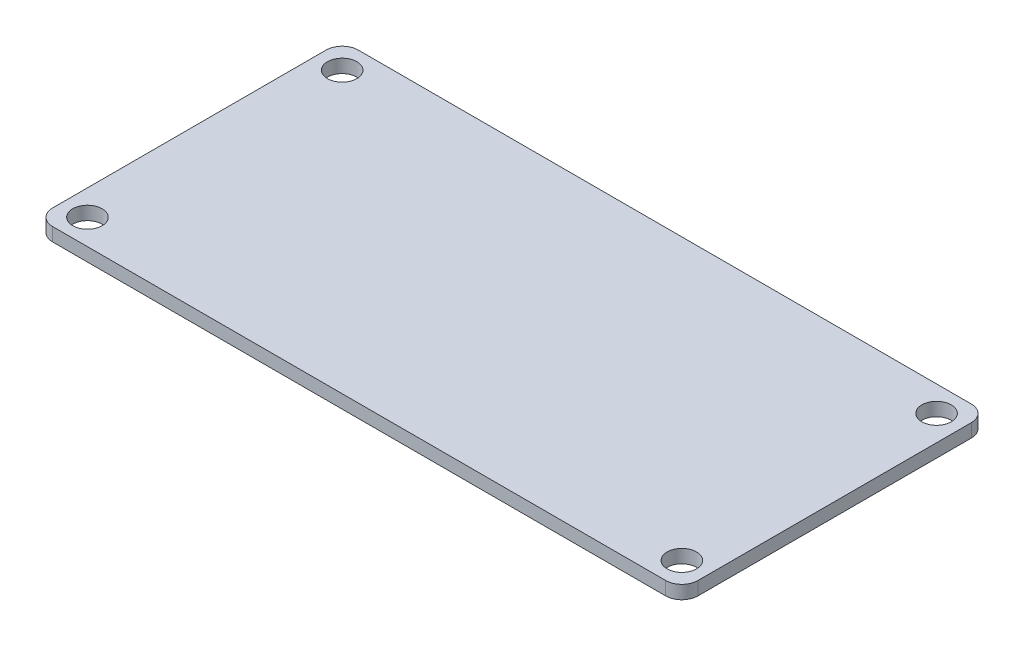
ISO-10303-21;
HEADER;
FILE_DESCRIPTION(('STEP AP214'),'2;1');
FILE_NAME('part.step','',(''),(''),'','','');
FILE_SCHEMA(('AUTOMOTIVE_DESIGN { 1 0 10303 214 1 1 1 1 }'));
ENDSEC;
DATA;
#1=APPLICATION_CONTEXT('core data for automotive mechanical design processes');
#2=APPLICATION_PROTOCOL_DEFINITION('international standard','automotive_design',2000,#1);
#3=PRODUCT_CONTEXT('',#1,'mechanical');
#4=PRODUCT('Part','Part','',(#3));
#5=PRODUCT_RELATED_PRODUCT_CATEGORY('part','',(#4));
#6=PRODUCT_DEFINITION_FORMATION('','',#4);
#7=PRODUCT_DEFINITION_CONTEXT('part definition',#1,'design');
#8=PRODUCT_DEFINITION('design','',#6,#7);
#9=PRODUCT_DEFINITION_SHAPE('','',#8);
#10=(LENGTH_UNIT() NAMED_UNIT(*) SI_UNIT(.MILLI.,.METRE.));
#11=(NAMED_UNIT(*) PLANE_ANGLE_UNIT() SI_UNIT($,.RADIAN.));
#12=(NAMED_UNIT(*) SI_UNIT($,.STERADIAN.) SOLID_ANGLE_UNIT());
#13=UNCERTAINTY_MEASURE_WITH_UNIT(LENGTH_MEASURE(1.E-05),#10,'distance_accuracy_value','');
#14=(GEOMETRIC_REPRESENTATION_CONTEXT(3) GLOBAL_UNCERTAINTY_ASSIGNED_CONTEXT((#13)) GLOBAL_UNIT_ASSIGNED_CONTEXT((#10,
#11,#12)) REPRESENTATION_CONTEXT('',''));
#15=CARTESIAN_POINT('',(0.,0.,0.));
#16=DIRECTION('',(0.,0.,1.));
#17=DIRECTION('',(1.,0.,0.));
#18=AXIS2_PLACEMENT_3D('',#15,#16,#17);
#19=CARTESIAN_POINT('',(0.,1.,0.));
#20=DIRECTION('',(1.,0.,0.));
#21=DIRECTION('',(0.,0.,-1.));
#22=AXIS2_PLACEMENT_3D('',#19,#20,#21);
#23=PLANE('',#22);
#24=DIRECTION('',(0.,0.,1.));
#25=VECTOR('',#24,1.);
#26=CARTESIAN_POINT('',(0.,1.,0.));
#27=LINE('',#26,#25);
#28=CARTESIAN_POINT('',(0.,1.,-21.6535));
#29=VERTEX_POINT('',#28);
#30=CARTESIAN_POINT('',(0.,1.,-1.2065));
#31=VERTEX_POINT('',#30);
#32=EDGE_CURVE('E198',#29,#31,#27,.T.);
#33=ORIENTED_EDGE('',*,*,#32,.F.);
#34=DIRECTION('',(0.,-1.,0.));
#35=VECTOR('',#34,1.);
#36=CARTESIAN_POINT('',(0.,1.,-21.6535));
#37=LINE('',#36,#35);
#38=CARTESIAN_POINT('',(0.,0.,-21.6535));
#39=VERTEX_POINT('',#38);
#40=EDGE_CURVE('E43',#29,#39,#37,.T.);
#41=ORIENTED_EDGE('',*,*,#40,.T.);
#42=DIRECTION('',(0.,0.,1.));
#43=VECTOR('',#42,1.);
#44=CARTESIAN_POINT('',(0.,0.,0.));
#45=LINE('',#44,#43);
#46=CARTESIAN_POINT('',(0.,0.,-15.43));
#47=VERTEX_POINT('',#46);
#48=EDGE_CURVE('E216',#39,#47,#45,.T.);
#49=ORIENTED_EDGE('',*,*,#48,.T.);
#50=CARTESIAN_POINT('',(0.,0.,-7.43));
#51=VERTEX_POINT('',#50);
#52=EDGE_CURVE('E221',#47,#51,#45,.T.);
#53=ORIENTED_EDGE('',*,*,#52,.T.);
#54=CARTESIAN_POINT('',(0.,0.,-1.2065));
#55=VERTEX_POINT('',#54);
#56=EDGE_CURVE('E197',#51,#55,#45,.T.);
#57=ORIENTED_EDGE('',*,*,#56,.T.);
#58=DIRECTION('',(0.,-1.,0.));
#59=VECTOR('',#58,1.);
#60=CARTESIAN_POINT('',(0.,1.,-1.2065));
#61=LINE('',#60,#59);
#62=EDGE_CURVE('E276',#55,#31,#61,.F.);
#63=ORIENTED_EDGE('',*,*,#62,.T.);
#64=EDGE_LOOP('',(#33,#41,#49,#53,#57,#63));
#65=FACE_BOUND('',#64,.T.);
#66=ADVANCED_FACE('F39',(#65),#23,.F.);
#67=CARTESIAN_POINT('',(0.,1.,0.));
#68=DIRECTION('',(0.,0.,-1.));
#69=DIRECTION('',(-1.,0.,0.));
#70=AXIS2_PLACEMENT_3D('',#67,#68,#69);
#71=PLANE('',#70);
#72=DIRECTION('',(1.,0.,0.));
#73=VECTOR('',#72,1.);
#74=CARTESIAN_POINT('',(0.,0.,0.));
#75=LINE('',#74,#73);
#76=CARTESIAN_POINT('',(1.2065,0.,0.));
#77=VERTEX_POINT('',#76);
#78=CARTESIAN_POINT('',(47.0535,0.,0.));
#79=VERTEX_POINT('',#78);
#80=EDGE_CURVE('E220',#77,#79,#75,.T.);
#81=ORIENTED_EDGE('',*,*,#80,.T.);
#82=DIRECTION('',(0.,-1.,0.));
#83=VECTOR('',#82,1.);
#84=CARTESIAN_POINT('',(47.0535,1.,0.));
#85=LINE('',#84,#83);
#86=CARTESIAN_POINT('',(47.0535,1.,0.));
#87=VERTEX_POINT('',#86);
#88=EDGE_CURVE('E274',#79,#87,#85,.F.);
#89=ORIENTED_EDGE('',*,*,#88,.T.);
#90=DIRECTION('',(1.,0.,0.));
#91=VECTOR('',#90,1.);
#92=CARTESIAN_POINT('',(0.,1.,0.));
#93=LINE('',#92,#91);
#94=CARTESIAN_POINT('',(1.2065,1.,0.));
#95=VERTEX_POINT('',#94);
#96=EDGE_CURVE('E202',#95,#87,#93,.T.);
#97=ORIENTED_EDGE('',*,*,#96,.F.);
#98=DIRECTION('',(0.,-1.,0.));
#99=VECTOR('',#98,1.);
#100=CARTESIAN_POINT('',(1.2065,1.,0.));
#101=LINE('',#100,#99);
#102=EDGE_CURVE('E270',#95,#77,#101,.T.);
#103=ORIENTED_EDGE('',*,*,#102,.T.);
#104=EDGE_LOOP('',(#81,#89,#97,#103));
#105=FACE_BOUND('',#104,.T.);
#106=ADVANCED_FACE('F331',(#105),#71,.F.);
#107=CARTESIAN_POINT('',(48.26,1.,0.));
#108=DIRECTION('',(-1.,0.,0.));
#109=DIRECTION('',(0.,0.,1.));
#110=AXIS2_PLACEMENT_3D('',#107,#108,#109);
#111=PLANE('',#110);
#112=DIRECTION('',(0.,0.,-1.));
#113=VECTOR('',#112,1.);
#114=CARTESIAN_POINT('',(48.26,0.,0.));
#115=LINE('',#114,#113);
#116=CARTESIAN_POINT('',(48.26,0.,-1.2065));
#117=VERTEX_POINT('',#116);
#118=CARTESIAN_POINT('',(48.26,0.,-21.6535));
#119=VERTEX_POINT('',#118);
#120=EDGE_CURVE('E225',#117,#119,#115,.T.);
#121=ORIENTED_EDGE('',*,*,#120,.T.);
#122=DIRECTION('',(0.,-1.,0.));
#123=VECTOR('',#122,1.);
#124=CARTESIAN_POINT('',(48.26,1.,-21.6535));
#125=LINE('',#124,#123);
#126=CARTESIAN_POINT('',(48.26,1.,-21.6535));
#127=VERTEX_POINT('',#126);
#128=EDGE_CURVE('E255',#119,#127,#125,.F.);
#129=ORIENTED_EDGE('',*,*,#128,.T.);
#130=DIRECTION('',(0.,0.,-1.));
#131=VECTOR('',#130,1.);
#132=CARTESIAN_POINT('',(48.26,1.,0.));
#133=LINE('',#132,#131);
#134=CARTESIAN_POINT('',(48.26,1.,-1.2065));
#135=VERTEX_POINT('',#134);
#136=EDGE_CURVE('E207',#135,#127,#133,.T.);
#137=ORIENTED_EDGE('',*,*,#136,.F.);
#138=DIRECTION('',(0.,-1.,0.));
#139=VECTOR('',#138,1.);
#140=CARTESIAN_POINT('',(48.26,1.,-1.2065));
#141=LINE('',#140,#139);
#142=EDGE_CURVE('E251',#135,#117,#141,.T.);
#143=ORIENTED_EDGE('',*,*,#142,.T.);
#144=EDGE_LOOP('',(#121,#129,#137,#143));
#145=FACE_BOUND('',#144,.T.);
#146=ADVANCED_FACE('F339',(#145),#111,.F.);
#147=CARTESIAN_POINT('',(0.,1.,-22.86));
#148=DIRECTION('',(0.,0.,1.));
#149=DIRECTION('',(1.,0.,0.));
#150=AXIS2_PLACEMENT_3D('',#147,#148,#149);
#151=PLANE('',#150);
#152=DIRECTION('',(-1.,0.,0.));
#153=VECTOR('',#152,1.);
#154=CARTESIAN_POINT('',(0.,1.,-22.86));
#155=LINE('',#154,#153);
#156=CARTESIAN_POINT('',(47.0535,1.,-22.86));
#157=VERTEX_POINT('',#156);
#158=CARTESIAN_POINT('',(1.2065,1.,-22.86));
#159=VERTEX_POINT('',#158);
#160=EDGE_CURVE('E211',#157,#159,#155,.T.);
#161=ORIENTED_EDGE('',*,*,#160,.F.);
#162=DIRECTION('',(0.,-1.,0.));
#163=VECTOR('',#162,1.);
#164=CARTESIAN_POINT('',(47.0535,1.,-22.86));
#165=LINE('',#164,#163);
#166=CARTESIAN_POINT('',(47.0535,0.,-22.86));
#167=VERTEX_POINT('',#166);
#168=EDGE_CURVE('E234',#157,#167,#165,.T.);
#169=ORIENTED_EDGE('',*,*,#168,.T.);
#170=DIRECTION('',(-1.,0.,0.));
#171=VECTOR('',#170,1.);
#172=CARTESIAN_POINT('',(0.,0.,-22.86));
#173=LINE('',#172,#171);
#174=CARTESIAN_POINT('',(1.2065,0.,-22.86));
#175=VERTEX_POINT('',#174);
#176=EDGE_CURVE('E203',#167,#175,#173,.T.);
#177=ORIENTED_EDGE('',*,*,#176,.T.);
#178=DIRECTION('',(0.,-1.,0.));
#179=VECTOR('',#178,1.);
#180=CARTESIAN_POINT('',(1.2065,1.,-22.86));
#181=LINE('',#180,#179);
#182=EDGE_CURVE('E215',#175,#159,#181,.F.);
#183=ORIENTED_EDGE('',*,*,#182,.T.);
#184=EDGE_LOOP('',(#161,#169,#177,#183));
#185=FACE_BOUND('',#184,.T.);
#186=ADVANCED_FACE('F347',(#185),#151,.F.);
#187=CARTESIAN_POINT('',(0.,1.,0.));
#188=DIRECTION('',(0.,-1.,0.));
#189=DIRECTION('',(0.,0.,-1.));
#190=AXIS2_PLACEMENT_3D('',#187,#188,#189);
#191=PLANE('',#190);
#192=CARTESIAN_POINT('',(46.355,1.,-20.955));
#193=DIRECTION('',(0.,-1.,0.));
#194=DIRECTION('',(0.,0.,-1.));
#195=AXIS2_PLACEMENT_3D('',#192,#193,#194);
#196=CIRCLE('',#195,1.09982);
#197=CARTESIAN_POINT('',(46.355,1.,-22.05482));
#198=VERTEX_POINT('',#197);
#199=EDGE_CURVE('E193',#198,#198,#196,.T.);
#200=ORIENTED_EDGE('',*,*,#199,.T.);
#201=EDGE_LOOP('',(#200));
#202=FACE_BOUND('',#201,.T.);
#203=CARTESIAN_POINT('',(46.355,1.,-1.905));
#204=DIRECTION('',(0.,-1.,0.));
#205=DIRECTION('',(0.,0.,-1.));
#206=AXIS2_PLACEMENT_3D('',#203,#204,#205);
#207=CIRCLE('',#206,1.09982);
#208=CARTESIAN_POINT('',(46.355,1.,-3.00482));
#209=VERTEX_POINT('',#208);
#210=EDGE_CURVE('E189',#209,#209,#207,.T.);
#211=ORIENTED_EDGE('',*,*,#210,.T.);
#212=EDGE_LOOP('',(#211));
#213=FACE_BOUND('',#212,.T.);
#214=CARTESIAN_POINT('',(1.905,1.,-1.905));
#215=DIRECTION('',(0.,-1.,0.));
#216=DIRECTION('',(0.,0.,-1.));
#217=AXIS2_PLACEMENT_3D('',#214,#215,#216);
#218=CIRCLE('',#217,1.09982);
#219=CARTESIAN_POINT('',(1.905,1.,-3.00482));
#220=VERTEX_POINT('',#219);
#221=EDGE_CURVE('E185',#220,#220,#218,.T.);
#222=ORIENTED_EDGE('',*,*,#221,.T.);
#223=EDGE_LOOP('',(#222));
#224=FACE_BOUND('',#223,.T.);
#225=CARTESIAN_POINT('',(1.905,1.,-20.955));
#226=DIRECTION('',(0.,-1.,0.));
#227=DIRECTION('',(0.,0.,-1.));
#228=AXIS2_PLACEMENT_3D('',#225,#226,#227);
#229=CIRCLE('',#228,1.09982);
#230=CARTESIAN_POINT('',(1.905,1.,-22.05482));
#231=VERTEX_POINT('',#230);
#232=EDGE_CURVE('E181',#231,#231,#229,.T.);
#233=ORIENTED_EDGE('',*,*,#232,.T.);
#234=EDGE_LOOP('',(#233));
#235=FACE_BOUND('',#234,.T.);
#236=ORIENTED_EDGE('',*,*,#136,.T.);
#237=CARTESIAN_POINT('',(47.0535,1.,-21.6535));
#238=DIRECTION('',(0.,-1.,0.));
#239=DIRECTION('',(0.,0.,-1.));
#240=AXIS2_PLACEMENT_3D('',#237,#238,#239);
#241=CIRCLE('',#240,1.2065);
#242=EDGE_CURVE('E267',#127,#157,#241,.F.);
#243=ORIENTED_EDGE('',*,*,#242,.T.);
#244=ORIENTED_EDGE('',*,*,#160,.T.);
#245=CARTESIAN_POINT('',(1.2065,1.,-21.6535));
#246=DIRECTION('',(0.,-1.,0.));
#247=DIRECTION('',(0.,0.,-1.));
#248=AXIS2_PLACEMENT_3D('',#245,#246,#247);
#249=CIRCLE('',#248,1.2065);
#250=EDGE_CURVE('E261',#159,#29,#249,.F.);
#251=ORIENTED_EDGE('',*,*,#250,.T.);
#252=ORIENTED_EDGE('',*,*,#32,.T.);
#253=CARTESIAN_POINT('',(1.2065,1.,-1.2065));
#254=DIRECTION('',(0.,-1.,0.));
#255=DIRECTION('',(0.,0.,-1.));
#256=AXIS2_PLACEMENT_3D('',#253,#254,#255);
#257=CIRCLE('',#256,1.2065);
#258=EDGE_CURVE('E258',#31,#95,#257,.F.);
#259=ORIENTED_EDGE('',*,*,#258,.T.);
#260=ORIENTED_EDGE('',*,*,#96,.T.);
#261=CARTESIAN_POINT('',(47.0535,1.,-1.2065));
#262=DIRECTION('',(0.,-1.,0.));
#263=DIRECTION('',(0.,0.,-1.));
#264=AXIS2_PLACEMENT_3D('',#261,#262,#263);
#265=CIRCLE('',#264,1.2065);
#266=EDGE_CURVE('E264',#87,#135,#265,.F.);
#267=ORIENTED_EDGE('',*,*,#266,.T.);
#268=EDGE_LOOP('',(#236,#243,#244,#251,#252,#259,#260,#267));
#269=FACE_BOUND('',#268,.T.);
#270=ADVANCED_FACE('F328',(#202,#213,#224,#235,#269),#191,.F.);
#271=CARTESIAN_POINT('',(0.,0.,0.));
#272=DIRECTION('',(0.,-1.,0.));
#273=DIRECTION('',(0.,0.,-1.));
#274=AXIS2_PLACEMENT_3D('',#271,#272,#273);
#275=PLANE('',#274);
#276=DIRECTION('',(1.,0.,0.));
#277=VECTOR('',#276,1.);
#278=CARTESIAN_POINT('',(5.1,0.,-15.43));
#279=LINE('',#278,#277);
#280=CARTESIAN_POINT('',(5.1,0.,-15.43));
#281=VERTEX_POINT('',#280);
#282=EDGE_CURVE('E11',#47,#281,#279,.T.);
#283=ORIENTED_EDGE('',*,*,#282,.F.);
#284=ORIENTED_EDGE('',*,*,#48,.F.);
#285=CARTESIAN_POINT('',(1.2065,0.,-21.6535));
#286=DIRECTION('',(0.,-1.,0.));
#287=DIRECTION('',(0.,0.,-1.));
#288=AXIS2_PLACEMENT_3D('',#285,#286,#287);
#289=CIRCLE('',#288,1.2065);
#290=EDGE_CURVE('E242',#39,#175,#289,.T.);
#291=ORIENTED_EDGE('',*,*,#290,.T.);
#292=ORIENTED_EDGE('',*,*,#176,.F.);
#293=CARTESIAN_POINT('',(47.0535,0.,-21.6535));
#294=DIRECTION('',(0.,-1.,0.));
#295=DIRECTION('',(0.,0.,-1.));
#296=AXIS2_PLACEMENT_3D('',#293,#294,#295);
#297=CIRCLE('',#296,1.2065);
#298=EDGE_CURVE('E248',#167,#119,#297,.T.);
#299=ORIENTED_EDGE('',*,*,#298,.T.);
#300=ORIENTED_EDGE('',*,*,#120,.F.);
#301=CARTESIAN_POINT('',(47.0535,0.,-1.2065));
#302=DIRECTION('',(0.,-1.,0.));
#303=DIRECTION('',(0.,0.,-1.));
#304=AXIS2_PLACEMENT_3D('',#301,#302,#303);
#305=CIRCLE('',#304,1.2065);
#306=EDGE_CURVE('E245',#117,#79,#305,.T.);
#307=ORIENTED_EDGE('',*,*,#306,.T.);
#308=ORIENTED_EDGE('',*,*,#80,.F.);
#309=CARTESIAN_POINT('',(1.2065,0.,-1.2065));
#310=DIRECTION('',(0.,-1.,0.));
#311=DIRECTION('',(0.,0.,-1.));
#312=AXIS2_PLACEMENT_3D('',#309,#310,#311);
#313=CIRCLE('',#312,1.2065);
#314=EDGE_CURVE('E238',#77,#55,#313,.T.);
#315=ORIENTED_EDGE('',*,*,#314,.T.);
#316=ORIENTED_EDGE('',*,*,#56,.F.);
#317=DIRECTION('',(-1.,0.,0.));
#318=VECTOR('',#317,1.);
#319=CARTESIAN_POINT('',(5.1,0.,-7.43));
#320=LINE('',#319,#318);
#321=CARTESIAN_POINT('',(5.1,0.,-7.43));
#322=VERTEX_POINT('',#321);
#323=EDGE_CURVE('E61',#322,#51,#320,.T.);
#324=ORIENTED_EDGE('',*,*,#323,.F.);
#325=DIRECTION('',(0.,0.,1.));
#326=VECTOR('',#325,1.);
#327=CARTESIAN_POINT('',(5.1,0.,-15.43));
#328=LINE('',#327,#326);
#329=EDGE_CURVE('E57',#281,#322,#328,.T.);
#330=ORIENTED_EDGE('',*,*,#329,.F.);
#331=EDGE_LOOP('',(#283,#284,#291,#292,#299,#300,#307,#308,#315,#316,#324,#330));
#332=FACE_BOUND('',#331,.T.);
#333=CARTESIAN_POINT('',(46.355,0.,-20.955));
#334=DIRECTION('',(0.,1.,0.));
#335=DIRECTION('',(0.,0.,1.));
#336=AXIS2_PLACEMENT_3D('',#333,#334,#335);
#337=CIRCLE('',#336,1.09982);
#338=CARTESIAN_POINT('',(46.355,0.,-19.85518));
#339=VERTEX_POINT('',#338);
#340=EDGE_CURVE('E159',#339,#339,#337,.T.);
#341=ORIENTED_EDGE('',*,*,#340,.T.);
#342=EDGE_LOOP('',(#341));
#343=FACE_BOUND('',#342,.T.);
#344=CARTESIAN_POINT('',(46.355,0.,-1.905));
#345=DIRECTION('',(0.,1.,0.));
#346=DIRECTION('',(0.,0.,1.));
#347=AXIS2_PLACEMENT_3D('',#344,#345,#346);
#348=CIRCLE('',#347,1.09982);
#349=CARTESIAN_POINT('',(46.355,0.,-0.805179999999998));
#350=VERTEX_POINT('',#349);
#351=EDGE_CURVE('E164',#350,#350,#348,.T.);
#352=ORIENTED_EDGE('',*,*,#351,.T.);
#353=EDGE_LOOP('',(#352));
#354=FACE_BOUND('',#353,.T.);
#355=CARTESIAN_POINT('',(1.905,0.,-1.905));
#356=DIRECTION('',(0.,1.,0.));
#357=DIRECTION('',(0.,0.,1.));
#358=AXIS2_PLACEMENT_3D('',#355,#356,#357);
#359=CIRCLE('',#358,1.09982);
#360=CARTESIAN_POINT('',(1.905,0.,-0.805180000000001));
#361=VERTEX_POINT('',#360);
#362=EDGE_CURVE('E170',#361,#361,#359,.T.);
#363=ORIENTED_EDGE('',*,*,#362,.T.);
#364=EDGE_LOOP('',(#363));
#365=FACE_BOUND('',#364,.T.);
#366=CARTESIAN_POINT('',(1.905,0.,-20.955));
#367=DIRECTION('',(0.,1.,0.));
#368=DIRECTION('',(0.,0.,1.));
#369=AXIS2_PLACEMENT_3D('',#366,#367,#368);
#370=CIRCLE('',#369,1.09982);
#371=CARTESIAN_POINT('',(1.905,0.,-19.85518));
#372=VERTEX_POINT('',#371);
#373=EDGE_CURVE('E174',#372,#372,#370,.T.);
#374=ORIENTED_EDGE('',*,*,#373,.T.);
#375=EDGE_LOOP('',(#374));
#376=FACE_BOUND('',#375,.T.);
#377=ADVANCED_FACE('F288',(#332,#343,#354,#365,#376),#275,.T.);
#378=CARTESIAN_POINT('',(1.905,0.,-20.955));
#379=DIRECTION('',(0.,1.,0.));
#380=DIRECTION('',(0.,0.,1.));
#381=AXIS2_PLACEMENT_3D('',#378,#379,#380);
#382=CYLINDRICAL_SURFACE('',#381,1.09982);
#383=ORIENTED_EDGE('',*,*,#373,.F.);
#384=EDGE_LOOP('',(#383));
#385=FACE_BOUND('',#384,.T.);
#386=ORIENTED_EDGE('',*,*,#232,.F.);
#387=EDGE_LOOP('',(#386));
#388=FACE_BOUND('',#387,.T.);
#389=ADVANCED_FACE('F384',(#385,#388),#382,.F.);
#390=CARTESIAN_POINT('',(1.905,0.,-1.905));
#391=DIRECTION('',(0.,1.,0.));
#392=DIRECTION('',(0.,0.,1.));
#393=AXIS2_PLACEMENT_3D('',#390,#391,#392);
#394=CYLINDRICAL_SURFACE('',#393,1.09982);
#395=ORIENTED_EDGE('',*,*,#362,.F.);
#396=EDGE_LOOP('',(#395));
#397=FACE_BOUND('',#396,.T.);
#398=ORIENTED_EDGE('',*,*,#221,.F.);
#399=EDGE_LOOP('',(#398));
#400=FACE_BOUND('',#399,.T.);
#401=ADVANCED_FACE('F377',(#397,#400),#394,.F.);
#402=CARTESIAN_POINT('',(46.355,0.,-1.905));
#403=DIRECTION('',(0.,1.,0.));
#404=DIRECTION('',(0.,0.,1.));
#405=AXIS2_PLACEMENT_3D('',#402,#403,#404);
#406=CYLINDRICAL_SURFACE('',#405,1.09982);
#407=ORIENTED_EDGE('',*,*,#351,.F.);
#408=EDGE_LOOP('',(#407));
#409=FACE_BOUND('',#408,.T.);
#410=ORIENTED_EDGE('',*,*,#210,.F.);
#411=EDGE_LOOP('',(#410));
#412=FACE_BOUND('',#411,.T.);
#413=ADVANCED_FACE('F371',(#409,#412),#406,.F.);
#414=CARTESIAN_POINT('',(46.355,0.,-20.955));
#415=DIRECTION('',(0.,1.,0.));
#416=DIRECTION('',(0.,0.,1.));
#417=AXIS2_PLACEMENT_3D('',#414,#415,#416);
#418=CYLINDRICAL_SURFACE('',#417,1.09982);
#419=ORIENTED_EDGE('',*,*,#340,.F.);
#420=EDGE_LOOP('',(#419));
#421=FACE_BOUND('',#420,.T.);
#422=ORIENTED_EDGE('',*,*,#199,.F.);
#423=EDGE_LOOP('',(#422));
#424=FACE_BOUND('',#423,.T.);
#425=ADVANCED_FACE('F367',(#421,#424),#418,.F.);
#426=CARTESIAN_POINT('',(47.0535,1.,-21.6535));
#427=DIRECTION('',(0.,-1.,0.));
#428=DIRECTION('',(0.,0.,-1.));
#429=AXIS2_PLACEMENT_3D('',#426,#427,#428);
#430=CYLINDRICAL_SURFACE('',#429,1.2065);
#431=ORIENTED_EDGE('',*,*,#242,.F.);
#432=ORIENTED_EDGE('',*,*,#128,.F.);
#433=ORIENTED_EDGE('',*,*,#298,.F.);
#434=ORIENTED_EDGE('',*,*,#168,.F.);
#435=EDGE_LOOP('',(#431,#432,#433,#434));
#436=FACE_BOUND('',#435,.T.);
#437=ADVANCED_FACE('F343',(#436),#430,.T.);
#438=CARTESIAN_POINT('',(47.0535,1.,-1.2065));
#439=DIRECTION('',(0.,-1.,0.));
#440=DIRECTION('',(0.,0.,-1.));
#441=AXIS2_PLACEMENT_3D('',#438,#439,#440);
#442=CYLINDRICAL_SURFACE('',#441,1.2065);
#443=ORIENTED_EDGE('',*,*,#266,.F.);
#444=ORIENTED_EDGE('',*,*,#88,.F.);
#445=ORIENTED_EDGE('',*,*,#306,.F.);
#446=ORIENTED_EDGE('',*,*,#142,.F.);
#447=EDGE_LOOP('',(#443,#444,#445,#446));
#448=FACE_BOUND('',#447,.T.);
#449=ADVANCED_FACE('F334',(#448),#442,.T.);
#450=CARTESIAN_POINT('',(1.2065,1.,-21.6535));
#451=DIRECTION('',(0.,-1.,0.));
#452=DIRECTION('',(0.,0.,-1.));
#453=AXIS2_PLACEMENT_3D('',#450,#451,#452);
#454=CYLINDRICAL_SURFACE('',#453,1.2065);
#455=ORIENTED_EDGE('',*,*,#250,.F.);
#456=ORIENTED_EDGE('',*,*,#182,.F.);
#457=ORIENTED_EDGE('',*,*,#290,.F.);
#458=ORIENTED_EDGE('',*,*,#40,.F.);
#459=EDGE_LOOP('',(#455,#456,#457,#458));
#460=FACE_BOUND('',#459,.T.);
#461=ADVANCED_FACE('F349',(#460),#454,.T.);
#462=CARTESIAN_POINT('',(1.2065,1.,-1.2065));
#463=DIRECTION('',(0.,-1.,0.));
#464=DIRECTION('',(0.,0.,-1.));
#465=AXIS2_PLACEMENT_3D('',#462,#463,#464);
#466=CYLINDRICAL_SURFACE('',#465,1.2065);
#467=ORIENTED_EDGE('',*,*,#258,.F.);
#468=ORIENTED_EDGE('',*,*,#62,.F.);
#469=ORIENTED_EDGE('',*,*,#314,.F.);
#470=ORIENTED_EDGE('',*,*,#102,.F.);
#471=EDGE_LOOP('',(#467,#468,#469,#470));
#472=FACE_BOUND('',#471,.T.);
#473=ADVANCED_FACE('F41',(#472),#466,.T.);
#474=CARTESIAN_POINT('',(5.1,-3.5,-15.43));
#475=DIRECTION('',(-1.,0.,0.));
#476=DIRECTION('',(0.,0.,1.));
#477=AXIS2_PLACEMENT_3D('',#474,#475,#476);
#478=PLANE('',#477);
#479=ORIENTED_EDGE('',*,*,#329,.T.);
#480=DIRECTION('',(0.,1.,0.));
#481=VECTOR('',#480,1.);
#482=CARTESIAN_POINT('',(5.1,-3.5,-7.43));
#483=LINE('',#482,#481);
#484=CARTESIAN_POINT('',(5.1,-3.5,-7.43));
#485=VERTEX_POINT('',#484);
#486=EDGE_CURVE('E139',#485,#322,#483,.T.);
#487=ORIENTED_EDGE('',*,*,#486,.F.);
#488=DIRECTION('',(0.,0.,1.));
#489=VECTOR('',#488,1.);
#490=CARTESIAN_POINT('',(5.1,-3.5,-15.43));
#491=LINE('',#490,#489);
#492=CARTESIAN_POINT('',(5.1,-3.5,-15.43));
#493=VERTEX_POINT('',#492);
#494=EDGE_CURVE('E146',#493,#485,#491,.T.);
#495=ORIENTED_EDGE('',*,*,#494,.F.);
#496=DIRECTION('',(0.,1.,0.));
#497=VECTOR('',#496,1.);
#498=CARTESIAN_POINT('',(5.1,-3.5,-15.43));
#499=LINE('',#498,#497);
#500=EDGE_CURVE('E294',#493,#281,#499,.T.);
#501=ORIENTED_EDGE('',*,*,#500,.T.);
#502=EDGE_LOOP('',(#479,#487,#495,#501));
#503=FACE_BOUND('',#502,.T.);
#504=ADVANCED_FACE('F157',(#503),#478,.F.);
#505=CARTESIAN_POINT('',(5.1,-3.5,-7.43));
#506=DIRECTION('',(0.,0.,-1.));
#507=DIRECTION('',(-1.,0.,0.));
#508=AXIS2_PLACEMENT_3D('',#505,#506,#507);
#509=PLANE('',#508);
#510=ORIENTED_EDGE('',*,*,#323,.T.);
#511=CARTESIAN_POINT('',(-1.,0.,-7.43));
#512=VERTEX_POINT('',#511);
#513=EDGE_CURVE('E309',#51,#512,#320,.T.);
#514=ORIENTED_EDGE('',*,*,#513,.T.);
#515=DIRECTION('',(0.,1.,0.));
#516=VECTOR('',#515,1.);
#517=CARTESIAN_POINT('',(-1.,-3.5,-7.43));
#518=LINE('',#517,#516);
#519=CARTESIAN_POINT('',(-1.,-3.5,-7.43));
#520=VERTEX_POINT('',#519);
#521=EDGE_CURVE('E141',#520,#512,#518,.T.);
#522=ORIENTED_EDGE('',*,*,#521,.F.);
#523=DIRECTION('',(-1.,0.,0.));
#524=VECTOR('',#523,1.);
#525=CARTESIAN_POINT('',(5.1,-3.5,-7.43));
#526=LINE('',#525,#524);
#527=EDGE_CURVE('E135',#485,#520,#526,.T.);
#528=ORIENTED_EDGE('',*,*,#527,.F.);
#529=ORIENTED_EDGE('',*,*,#486,.T.);
#530=EDGE_LOOP('',(#510,#514,#522,#528,#529));
#531=FACE_BOUND('',#530,.T.);
#532=ADVANCED_FACE('F137',(#531),#509,.F.);
#533=CARTESIAN_POINT('',(-1.,-3.5,-15.43));
#534=DIRECTION('',(1.,0.,0.));
#535=DIRECTION('',(0.,0.,-1.));
#536=AXIS2_PLACEMENT_3D('',#533,#534,#535);
#537=PLANE('',#536);
#538=DIRECTION('',(0.,0.,-1.));
#539=VECTOR('',#538,1.);
#540=CARTESIAN_POINT('',(-1.,0.,-15.43));
#541=LINE('',#540,#539);
#542=CARTESIAN_POINT('',(-1.,0.,-15.43));
#543=VERTEX_POINT('',#542);
#544=EDGE_CURVE('E304',#512,#543,#541,.T.);
#545=ORIENTED_EDGE('',*,*,#544,.T.);
#546=DIRECTION('',(0.,1.,0.));
#547=VECTOR('',#546,1.);
#548=CARTESIAN_POINT('',(-1.,-3.5,-15.43));
#549=LINE('',#548,#547);
#550=CARTESIAN_POINT('',(-1.,-3.5,-15.43));
#551=VERTEX_POINT('',#550);
#552=EDGE_CURVE('E166',#551,#543,#549,.T.);
#553=ORIENTED_EDGE('',*,*,#552,.F.);
#554=DIRECTION('',(0.,0.,-1.));
#555=VECTOR('',#554,1.);
#556=CARTESIAN_POINT('',(-1.,-3.5,-15.43));
#557=LINE('',#556,#555);
#558=EDGE_CURVE('E145',#520,#551,#557,.T.);
#559=ORIENTED_EDGE('',*,*,#558,.F.);
#560=ORIENTED_EDGE('',*,*,#521,.T.);
#561=EDGE_LOOP('',(#545,#553,#559,#560));
#562=FACE_BOUND('',#561,.T.);
#563=ADVANCED_FACE('F315',(#562),#537,.F.);
#564=CARTESIAN_POINT('',(5.1,-3.5,-15.43));
#565=DIRECTION('',(0.,0.,1.));
#566=DIRECTION('',(1.,0.,0.));
#567=AXIS2_PLACEMENT_3D('',#564,#565,#566);
#568=PLANE('',#567);
#569=EDGE_CURVE('E50',#543,#47,#279,.T.);
#570=ORIENTED_EDGE('',*,*,#569,.T.);
#571=ORIENTED_EDGE('',*,*,#282,.T.);
#572=ORIENTED_EDGE('',*,*,#500,.F.);
#573=DIRECTION('',(1.,0.,0.));
#574=VECTOR('',#573,1.);
#575=CARTESIAN_POINT('',(5.1,-3.5,-15.43));
#576=LINE('',#575,#574);
#577=EDGE_CURVE('E151',#551,#493,#576,.T.);
#578=ORIENTED_EDGE('',*,*,#577,.F.);
#579=ORIENTED_EDGE('',*,*,#552,.T.);
#580=EDGE_LOOP('',(#570,#571,#572,#578,#579));
#581=FACE_BOUND('',#580,.T.);
#582=ADVANCED_FACE('F293',(#581),#568,.F.);
#583=CARTESIAN_POINT('',(0.,-3.5,0.));
#584=DIRECTION('',(0.,-1.,0.));
#585=DIRECTION('',(0.,0.,-1.));
#586=AXIS2_PLACEMENT_3D('',#583,#584,#585);
#587=PLANE('',#586);
#588=ORIENTED_EDGE('',*,*,#494,.T.);
#589=ORIENTED_EDGE('',*,*,#527,.T.);
#590=ORIENTED_EDGE('',*,*,#558,.T.);
#591=ORIENTED_EDGE('',*,*,#577,.T.);
#592=EDGE_LOOP('',(#588,#589,#590,#591));
#593=FACE_BOUND('',#592,.T.);
#594=ADVANCED_FACE('F149',(#593),#587,.T.);
#595=CARTESIAN_POINT('',(0.,0.,0.));
#596=DIRECTION('',(0.,-1.,0.));
#597=DIRECTION('',(0.,0.,-1.));
#598=AXIS2_PLACEMENT_3D('',#595,#596,#597);
#599=PLANE('',#598);
#600=ORIENTED_EDGE('',*,*,#52,.F.);
#601=ORIENTED_EDGE('',*,*,#569,.F.);
#602=ORIENTED_EDGE('',*,*,#544,.F.);
#603=ORIENTED_EDGE('',*,*,#513,.F.);
#604=EDGE_LOOP('',(#600,#601,#602,#603));
#605=FACE_BOUND('',#604,.T.);
#606=ADVANCED_FACE('F318',(#605),#599,.F.);
#607=CLOSED_SHELL('',(#66,#106,#146,#186,#270,#377,#389,#401,#413,#425,#437,#449,#461,#473,#504,
#532,#563,#582,#594,#606));
#608=MANIFOLD_SOLID_BREP('B2',#607);
#609=ADVANCED_BREP_SHAPE_REPRESENTATION('',(#18,#608),#14);
#610=SHAPE_DEFINITION_REPRESENTATION(#9,#609);
ENDSEC;
END-ISO-10303-21;
